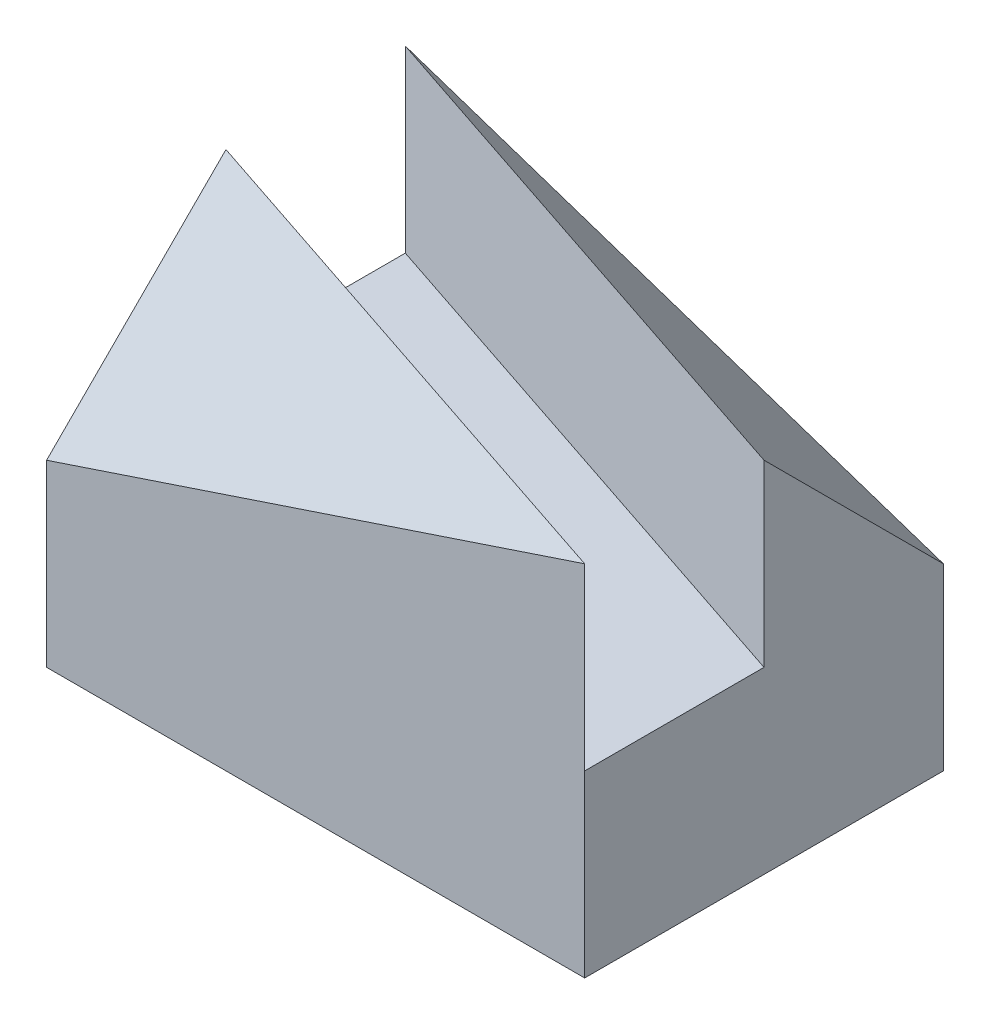
ISO-10303-21;
HEADER;
FILE_DESCRIPTION(('STEP AP214'),'2;1');
FILE_NAME('part.step','',(''),(''),'','','');
FILE_SCHEMA(('AUTOMOTIVE_DESIGN { 1 0 10303 214 1 1 1 1 }'));
ENDSEC;
DATA;
#1=APPLICATION_CONTEXT('core data for automotive mechanical design processes');
#2=APPLICATION_PROTOCOL_DEFINITION('international standard','automotive_design',2000,#1);
#3=PRODUCT_CONTEXT('',#1,'mechanical');
#4=PRODUCT('Part','Part','',(#3));
#5=PRODUCT_RELATED_PRODUCT_CATEGORY('part','',(#4));
#6=PRODUCT_DEFINITION_FORMATION('','',#4);
#7=PRODUCT_DEFINITION_CONTEXT('part definition',#1,'design');
#8=PRODUCT_DEFINITION('design','',#6,#7);
#9=PRODUCT_DEFINITION_SHAPE('','',#8);
#10=(LENGTH_UNIT() NAMED_UNIT(*) SI_UNIT(.MILLI.,.METRE.));
#11=(NAMED_UNIT(*) PLANE_ANGLE_UNIT() SI_UNIT($,.RADIAN.));
#12=(NAMED_UNIT(*) SI_UNIT($,.STERADIAN.) SOLID_ANGLE_UNIT());
#13=UNCERTAINTY_MEASURE_WITH_UNIT(LENGTH_MEASURE(1.E-05),#10,'distance_accuracy_value','');
#14=(GEOMETRIC_REPRESENTATION_CONTEXT(3) GLOBAL_UNCERTAINTY_ASSIGNED_CONTEXT((#13)) GLOBAL_UNIT_ASSIGNED_CONTEXT((#10,
#11,#12)) REPRESENTATION_CONTEXT('',''));
#15=CARTESIAN_POINT('',(0.,0.,0.));
#16=DIRECTION('',(0.,0.,1.));
#17=DIRECTION('',(1.,0.,0.));
#18=AXIS2_PLACEMENT_3D('',#15,#16,#17);
#19=CARTESIAN_POINT('',(0.,2.,-4.));
#20=DIRECTION('',(1.,0.,0.));
#21=DIRECTION('',(0.,0.,-1.));
#22=AXIS2_PLACEMENT_3D('',#19,#20,#21);
#23=PLANE('',#22);
#24=DIRECTION('',(0.,0.707106781186548,-0.707106781186548));
#25=VECTOR('',#24,1.);
#26=CARTESIAN_POINT('',(0.,2.,0.));
#27=LINE('',#26,#25);
#28=CARTESIAN_POINT('',(0.,2.,0.));
#29=VERTEX_POINT('',#28);
#30=CARTESIAN_POINT('',(0.,4.,-2.));
#31=VERTEX_POINT('',#30);
#32=EDGE_CURVE('E142',#29,#31,#27,.T.);
#33=ORIENTED_EDGE('',*,*,#32,.T.);
#34=DIRECTION('',(0.,-1.,0.));
#35=VECTOR('',#34,1.);
#36=CARTESIAN_POINT('',(0.,4.,-2.));
#37=LINE('',#36,#35);
#38=CARTESIAN_POINT('',(0.,2.,-2.));
#39=VERTEX_POINT('',#38);
#40=EDGE_CURVE('E131',#31,#39,#37,.T.);
#41=ORIENTED_EDGE('',*,*,#40,.T.);
#42=DIRECTION('',(0.,0.,1.));
#43=VECTOR('',#42,1.);
#44=CARTESIAN_POINT('',(0.,2.,-4.));
#45=LINE('',#44,#43);
#46=CARTESIAN_POINT('',(0.,2.,-4.));
#47=VERTEX_POINT('',#46);
#48=EDGE_CURVE('E53',#47,#39,#45,.T.);
#49=ORIENTED_EDGE('',*,*,#48,.F.);
#50=DIRECTION('',(0.,-1.,0.));
#51=VECTOR('',#50,1.);
#52=CARTESIAN_POINT('',(0.,2.,-4.));
#53=LINE('',#52,#51);
#54=CARTESIAN_POINT('',(0.,0.,-4.));
#55=VERTEX_POINT('',#54);
#56=EDGE_CURVE('E81',#47,#55,#53,.T.);
#57=ORIENTED_EDGE('',*,*,#56,.T.);
#58=DIRECTION('',(0.,0.,1.));
#59=VECTOR('',#58,1.);
#60=CARTESIAN_POINT('',(0.,0.,-4.));
#61=LINE('',#60,#59);
#62=CARTESIAN_POINT('',(0.,0.,0.));
#63=VERTEX_POINT('',#62);
#64=EDGE_CURVE('E94',#55,#63,#61,.T.);
#65=ORIENTED_EDGE('',*,*,#64,.T.);
#66=DIRECTION('',(0.,-1.,0.));
#67=VECTOR('',#66,1.);
#68=CARTESIAN_POINT('',(0.,2.,0.));
#69=LINE('',#68,#67);
#70=EDGE_CURVE('E12',#29,#63,#69,.T.);
#71=ORIENTED_EDGE('',*,*,#70,.F.);
#72=EDGE_LOOP('',(#33,#41,#49,#57,#65,#71));
#73=FACE_BOUND('',#72,.T.);
#74=ADVANCED_FACE('F37',(#73),#23,.F.);
#75=CARTESIAN_POINT('',(0.,2.,0.));
#76=DIRECTION('',(0.,0.,-1.));
#77=DIRECTION('',(-1.,0.,0.));
#78=AXIS2_PLACEMENT_3D('',#75,#76,#77);
#79=PLANE('',#78);
#80=DIRECTION('',(-0.948683298050514,-0.316227766016838,0.));
#81=VECTOR('',#80,1.);
#82=CARTESIAN_POINT('',(6.,4.,0.));
#83=LINE('',#82,#81);
#84=CARTESIAN_POINT('',(6.,4.,0.));
#85=VERTEX_POINT('',#84);
#86=EDGE_CURVE('E177',#85,#29,#83,.T.);
#87=ORIENTED_EDGE('',*,*,#86,.T.);
#88=ORIENTED_EDGE('',*,*,#70,.T.);
#89=DIRECTION('',(1.,0.,0.));
#90=VECTOR('',#89,1.);
#91=CARTESIAN_POINT('',(0.,0.,0.));
#92=LINE('',#91,#90);
#93=CARTESIAN_POINT('',(6.,0.,0.));
#94=VERTEX_POINT('',#93);
#95=EDGE_CURVE('E101',#63,#94,#92,.T.);
#96=ORIENTED_EDGE('',*,*,#95,.T.);
#97=DIRECTION('',(0.,-1.,0.));
#98=VECTOR('',#97,1.);
#99=CARTESIAN_POINT('',(6.,2.,0.));
#100=LINE('',#99,#98);
#101=CARTESIAN_POINT('',(6.,2.,0.));
#102=VERTEX_POINT('',#101);
#103=EDGE_CURVE('E45',#102,#94,#100,.T.);
#104=ORIENTED_EDGE('',*,*,#103,.F.);
#105=DIRECTION('',(0.,-1.,0.));
#106=VECTOR('',#105,1.);
#107=CARTESIAN_POINT('',(6.,4.,0.));
#108=LINE('',#107,#106);
#109=EDGE_CURVE('E135',#85,#102,#108,.T.);
#110=ORIENTED_EDGE('',*,*,#109,.F.);
#111=EDGE_LOOP('',(#87,#88,#96,#104,#110));
#112=FACE_BOUND('',#111,.T.);
#113=ADVANCED_FACE('F193',(#112),#79,.F.);
#114=CARTESIAN_POINT('',(6.,2.,0.));
#115=DIRECTION('',(-1.,0.,0.));
#116=DIRECTION('',(0.,0.,1.));
#117=AXIS2_PLACEMENT_3D('',#114,#115,#116);
#118=PLANE('',#117);
#119=DIRECTION('',(0.,0.707106781186548,0.707106781186548));
#120=VECTOR('',#119,1.);
#121=CARTESIAN_POINT('',(6.,2.,-4.));
#122=LINE('',#121,#120);
#123=CARTESIAN_POINT('',(6.,2.,-4.));
#124=VERTEX_POINT('',#123);
#125=CARTESIAN_POINT('',(6.,4.,-2.));
#126=VERTEX_POINT('',#125);
#127=EDGE_CURVE('E174',#124,#126,#122,.T.);
#128=ORIENTED_EDGE('',*,*,#127,.T.);
#129=DIRECTION('',(0.,-1.,0.));
#130=VECTOR('',#129,1.);
#131=CARTESIAN_POINT('',(6.,4.,-2.));
#132=LINE('',#131,#130);
#133=CARTESIAN_POINT('',(6.,2.,-2.));
#134=VERTEX_POINT('',#133);
#135=EDGE_CURVE('E105',#126,#134,#132,.T.);
#136=ORIENTED_EDGE('',*,*,#135,.T.);
#137=DIRECTION('',(0.,0.,-1.));
#138=VECTOR('',#137,1.);
#139=CARTESIAN_POINT('',(6.,2.,0.));
#140=LINE('',#139,#138);
#141=EDGE_CURVE('E97',#102,#134,#140,.T.);
#142=ORIENTED_EDGE('',*,*,#141,.F.);
#143=ORIENTED_EDGE('',*,*,#103,.T.);
#144=DIRECTION('',(0.,0.,-1.));
#145=VECTOR('',#144,1.);
#146=CARTESIAN_POINT('',(6.,0.,0.));
#147=LINE('',#146,#145);
#148=CARTESIAN_POINT('',(6.,0.,-4.));
#149=VERTEX_POINT('',#148);
#150=EDGE_CURVE('E88',#94,#149,#147,.T.);
#151=ORIENTED_EDGE('',*,*,#150,.T.);
#152=DIRECTION('',(0.,-1.,0.));
#153=VECTOR('',#152,1.);
#154=CARTESIAN_POINT('',(6.,2.,-4.));
#155=LINE('',#154,#153);
#156=EDGE_CURVE('E83',#124,#149,#155,.T.);
#157=ORIENTED_EDGE('',*,*,#156,.F.);
#158=EDGE_LOOP('',(#128,#136,#142,#143,#151,#157));
#159=FACE_BOUND('',#158,.T.);
#160=ADVANCED_FACE('F173',(#159),#118,.F.);
#161=CARTESIAN_POINT('',(6.,2.,-4.));
#162=DIRECTION('',(0.,0.,1.));
#163=DIRECTION('',(1.,0.,0.));
#164=AXIS2_PLACEMENT_3D('',#161,#162,#163);
#165=PLANE('',#164);
#166=DIRECTION('',(0.948683298050514,-0.316227766016838,0.));
#167=VECTOR('',#166,1.);
#168=CARTESIAN_POINT('',(0.,4.,-4.));
#169=LINE('',#168,#167);
#170=CARTESIAN_POINT('',(0.,4.,-4.));
#171=VERTEX_POINT('',#170);
#172=EDGE_CURVE('E176',#171,#124,#169,.T.);
#173=ORIENTED_EDGE('',*,*,#172,.T.);
#174=ORIENTED_EDGE('',*,*,#156,.T.);
#175=DIRECTION('',(-1.,0.,0.));
#176=VECTOR('',#175,1.);
#177=CARTESIAN_POINT('',(6.,0.,-4.));
#178=LINE('',#177,#176);
#179=EDGE_CURVE('E76',#149,#55,#178,.T.);
#180=ORIENTED_EDGE('',*,*,#179,.T.);
#181=ORIENTED_EDGE('',*,*,#56,.F.);
#182=DIRECTION('',(0.,-1.,0.));
#183=VECTOR('',#182,1.);
#184=CARTESIAN_POINT('',(0.,4.,-4.));
#185=LINE('',#184,#183);
#186=EDGE_CURVE('E102',#171,#47,#185,.T.);
#187=ORIENTED_EDGE('',*,*,#186,.F.);
#188=EDGE_LOOP('',(#173,#174,#180,#181,#187));
#189=FACE_BOUND('',#188,.T.);
#190=ADVANCED_FACE('F79',(#189),#165,.F.);
#191=CARTESIAN_POINT('',(0.,2.,0.));
#192=DIRECTION('',(0.,1.,0.));
#193=DIRECTION('',(0.,0.,1.));
#194=AXIS2_PLACEMENT_3D('',#191,#192,#193);
#195=PLANE('',#194);
#196=ORIENTED_EDGE('',*,*,#48,.T.);
#197=DIRECTION('',(-0.948683298050514,0.,-0.316227766016838));
#198=VECTOR('',#197,1.);
#199=CARTESIAN_POINT('',(0.,2.,-2.));
#200=LINE('',#199,#198);
#201=EDGE_CURVE('E132',#102,#39,#200,.T.);
#202=ORIENTED_EDGE('',*,*,#201,.F.);
#203=ORIENTED_EDGE('',*,*,#141,.T.);
#204=DIRECTION('',(0.948683298050514,0.,0.316227766016838));
#205=VECTOR('',#204,1.);
#206=CARTESIAN_POINT('',(0.,2.,-4.));
#207=LINE('',#206,#205);
#208=EDGE_CURVE('E59',#47,#134,#207,.T.);
#209=ORIENTED_EDGE('',*,*,#208,.F.);
#210=EDGE_LOOP('',(#196,#202,#203,#209));
#211=FACE_BOUND('',#210,.T.);
#212=ADVANCED_FACE('F163',(#211),#195,.T.);
#213=CARTESIAN_POINT('',(0.,0.,0.));
#214=DIRECTION('',(0.,1.,0.));
#215=DIRECTION('',(0.,0.,1.));
#216=AXIS2_PLACEMENT_3D('',#213,#214,#215);
#217=PLANE('',#216);
#218=ORIENTED_EDGE('',*,*,#64,.F.);
#219=ORIENTED_EDGE('',*,*,#179,.F.);
#220=ORIENTED_EDGE('',*,*,#150,.F.);
#221=ORIENTED_EDGE('',*,*,#95,.F.);
#222=EDGE_LOOP('',(#218,#219,#220,#221));
#223=FACE_BOUND('',#222,.T.);
#224=ADVANCED_FACE('F100',(#223),#217,.F.);
#225=CARTESIAN_POINT('',(0.,4.,-4.));
#226=DIRECTION('',(0.316227766016838,0.,-0.948683298050514));
#227=DIRECTION('',(-0.948683298050514,0.,-0.316227766016838));
#228=AXIS2_PLACEMENT_3D('',#225,#226,#227);
#229=PLANE('',#228);
#230=ORIENTED_EDGE('',*,*,#208,.T.);
#231=ORIENTED_EDGE('',*,*,#135,.F.);
#232=DIRECTION('',(0.948683298050514,0.,0.316227766016838));
#233=VECTOR('',#232,1.);
#234=CARTESIAN_POINT('',(0.,4.,-4.));
#235=LINE('',#234,#233);
#236=EDGE_CURVE('E117',#171,#126,#235,.T.);
#237=ORIENTED_EDGE('',*,*,#236,.F.);
#238=ORIENTED_EDGE('',*,*,#186,.T.);
#239=EDGE_LOOP('',(#230,#231,#237,#238));
#240=FACE_BOUND('',#239,.T.);
#241=ADVANCED_FACE('F169',(#240),#229,.F.);
#242=CARTESIAN_POINT('',(0.,4.,-2.));
#243=DIRECTION('',(-0.316227766016838,0.,0.948683298050514));
#244=DIRECTION('',(0.948683298050514,0.,0.316227766016838));
#245=AXIS2_PLACEMENT_3D('',#242,#243,#244);
#246=PLANE('',#245);
#247=ORIENTED_EDGE('',*,*,#201,.T.);
#248=ORIENTED_EDGE('',*,*,#40,.F.);
#249=DIRECTION('',(-0.948683298050514,0.,-0.316227766016838));
#250=VECTOR('',#249,1.);
#251=CARTESIAN_POINT('',(0.,4.,-2.));
#252=LINE('',#251,#250);
#253=EDGE_CURVE('E128',#85,#31,#252,.T.);
#254=ORIENTED_EDGE('',*,*,#253,.F.);
#255=ORIENTED_EDGE('',*,*,#109,.T.);
#256=EDGE_LOOP('',(#247,#248,#254,#255));
#257=FACE_BOUND('',#256,.T.);
#258=ADVANCED_FACE('F145',(#257),#246,.F.);
#259=CARTESIAN_POINT('',(1.26315789473684,3.78947368421053,-3.78947368421053));
#260=DIRECTION('',(0.229415733870562,0.688247201611685,-0.688247201611685));
#261=DIRECTION('',(0.,0.707106781186548,0.707106781186547));
#262=AXIS2_PLACEMENT_3D('',#259,#260,#261);
#263=PLANE('',#262);
#264=ORIENTED_EDGE('',*,*,#172,.F.);
#265=ORIENTED_EDGE('',*,*,#236,.T.);
#266=ORIENTED_EDGE('',*,*,#127,.F.);
#267=EDGE_LOOP('',(#264,#265,#266));
#268=FACE_BOUND('',#267,.T.);
#269=ADVANCED_FACE('F196',(#268),#263,.T.);
#270=CARTESIAN_POINT('',(-0.315789473684211,0.947368421052634,0.947368421052633));
#271=DIRECTION('',(-0.229415733870562,0.688247201611686,0.688247201611685));
#272=DIRECTION('',(0.,-0.707106781186547,0.707106781186548));
#273=AXIS2_PLACEMENT_3D('',#270,#271,#272);
#274=PLANE('',#273);
#275=ORIENTED_EDGE('',*,*,#86,.F.);
#276=ORIENTED_EDGE('',*,*,#253,.T.);
#277=ORIENTED_EDGE('',*,*,#32,.F.);
#278=EDGE_LOOP('',(#275,#276,#277));
#279=FACE_BOUND('',#278,.T.);
#280=ADVANCED_FACE('F194',(#279),#274,.T.);
#281=CLOSED_SHELL('',(#74,#113,#160,#190,#212,#224,#241,#258,#269,#280));
#282=MANIFOLD_SOLID_BREP('B2',#281);
#283=ADVANCED_BREP_SHAPE_REPRESENTATION('',(#18,#282),#14);
#284=SHAPE_DEFINITION_REPRESENTATION(#9,#283);
ENDSEC;
END-ISO-10303-21;
